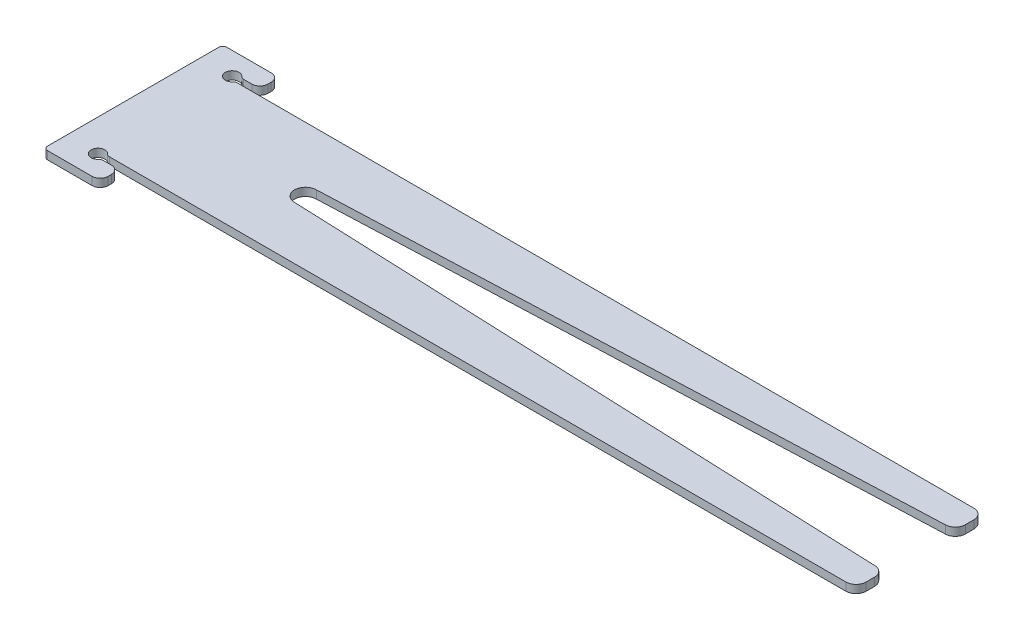
ISO-10303-21;
HEADER;
FILE_DESCRIPTION(('STEP AP214'),'2;1');
FILE_NAME('part.step','',(''),(''),'','','');
FILE_SCHEMA(('AUTOMOTIVE_DESIGN { 1 0 10303 214 1 1 1 1 }'));
ENDSEC;
DATA;
#1=APPLICATION_CONTEXT('core data for automotive mechanical design processes');
#2=APPLICATION_PROTOCOL_DEFINITION('international standard','automotive_design',2000,#1);
#3=PRODUCT_CONTEXT('',#1,'mechanical');
#4=PRODUCT('Part','Part','',(#3));
#5=PRODUCT_RELATED_PRODUCT_CATEGORY('part','',(#4));
#6=PRODUCT_DEFINITION_FORMATION('','',#4);
#7=PRODUCT_DEFINITION_CONTEXT('part definition',#1,'design');
#8=PRODUCT_DEFINITION('design','',#6,#7);
#9=PRODUCT_DEFINITION_SHAPE('','',#8);
#10=(LENGTH_UNIT() NAMED_UNIT(*) SI_UNIT(.MILLI.,.METRE.));
#11=(NAMED_UNIT(*) PLANE_ANGLE_UNIT() SI_UNIT($,.RADIAN.));
#12=(NAMED_UNIT(*) SI_UNIT($,.STERADIAN.) SOLID_ANGLE_UNIT());
#13=UNCERTAINTY_MEASURE_WITH_UNIT(LENGTH_MEASURE(1.E-05),#10,'distance_accuracy_value','');
#14=(GEOMETRIC_REPRESENTATION_CONTEXT(3) GLOBAL_UNCERTAINTY_ASSIGNED_CONTEXT((#13)) GLOBAL_UNIT_ASSIGNED_CONTEXT((#10,
#11,#12)) REPRESENTATION_CONTEXT('',''));
#15=CARTESIAN_POINT('',(0.,0.,0.));
#16=DIRECTION('',(0.,0.,1.));
#17=DIRECTION('',(1.,0.,0.));
#18=AXIS2_PLACEMENT_3D('',#15,#16,#17);
#19=CARTESIAN_POINT('',(-40.8449149219397,2.,7.08866538839723));
#20=DIRECTION('',(0.,-1.,0.));
#21=DIRECTION('',(0.,0.,-1.));
#22=AXIS2_PLACEMENT_3D('',#19,#20,#21);
#23=CYLINDRICAL_SURFACE('',#22,2.7);
#24=CARTESIAN_POINT('',(-40.8449149219397,0.,7.08866538839723));
#25=DIRECTION('',(0.,1.,0.));
#26=DIRECTION('',(0.,0.,1.));
#27=AXIS2_PLACEMENT_3D('',#24,#25,#26);
#28=CIRCLE('',#27,2.7);
#29=CARTESIAN_POINT('',(-40.8449149219397,0.,4.38866538839723));
#30=VERTEX_POINT('',#29);
#31=CARTESIAN_POINT('',(-40.8449149219397,0.,9.78866538839722));
#32=VERTEX_POINT('',#31);
#33=EDGE_CURVE('E237',#30,#32,#28,.T.);
#34=ORIENTED_EDGE('',*,*,#33,.F.);
#35=DIRECTION('',(0.,-1.,0.));
#36=VECTOR('',#35,1.);
#37=CARTESIAN_POINT('',(-40.8449149219397,2.,4.38866538839723));
#38=LINE('',#37,#36);
#39=CARTESIAN_POINT('',(-40.8449149219397,2.,4.38866538839723));
#40=VERTEX_POINT('',#39);
#41=EDGE_CURVE('E231',#40,#30,#38,.T.);
#42=ORIENTED_EDGE('',*,*,#41,.F.);
#43=CARTESIAN_POINT('',(-40.8449149219397,2.,7.08866538839723));
#44=DIRECTION('',(0.,1.,0.));
#45=DIRECTION('',(0.,0.,1.));
#46=AXIS2_PLACEMENT_3D('',#43,#44,#45);
#47=CIRCLE('',#46,2.7);
#48=CARTESIAN_POINT('',(-40.8449149219397,2.,9.78866538839722));
#49=VERTEX_POINT('',#48);
#50=EDGE_CURVE('E234',#40,#49,#47,.T.);
#51=ORIENTED_EDGE('',*,*,#50,.T.);
#52=DIRECTION('',(0.,-1.,0.));
#53=VECTOR('',#52,1.);
#54=CARTESIAN_POINT('',(-40.8449149219397,2.,9.78866538839722));
#55=LINE('',#54,#53);
#56=EDGE_CURVE('E242',#49,#32,#55,.T.);
#57=ORIENTED_EDGE('',*,*,#56,.T.);
#58=EDGE_LOOP('',(#34,#42,#51,#57));
#59=FACE_BOUND('',#58,.T.);
#60=ADVANCED_FACE('F33',(#59),#23,.F.);
#61=CARTESIAN_POINT('',(0.110435685191997,2.,2.73485444792539));
#62=DIRECTION('',(-0.0403479448080517,0.,-0.999185690124597));
#63=DIRECTION('',(-0.999185690124597,0.,0.0403479448080517));
#64=AXIS2_PLACEMENT_3D('',#61,#62,#63);
#65=PLANE('',#64);
#66=DIRECTION('',(0.999185690124597,0.,-0.0403479448080517));
#67=VECTOR('',#66,1.);
#68=CARTESIAN_POINT('',(0.110435685191997,0.,2.73485444792539));
#69=LINE('',#68,#67);
#70=CARTESIAN_POINT('',(109.05595494008,0.,-1.66445575179597));
#71=VERTEX_POINT('',#70);
#72=EDGE_CURVE('E294',#30,#71,#69,.T.);
#73=ORIENTED_EDGE('',*,*,#72,.T.);
#74=DIRECTION('',(0.,-1.,0.));
#75=VECTOR('',#74,1.);
#76=CARTESIAN_POINT('',(109.05595494008,2.,-1.66445575179597));
#77=LINE('',#76,#75);
#78=CARTESIAN_POINT('',(109.05595494008,2.,-1.66445575179597));
#79=VERTEX_POINT('',#78);
#80=EDGE_CURVE('E11',#71,#79,#77,.F.);
#81=ORIENTED_EDGE('',*,*,#80,.T.);
#82=DIRECTION('',(0.999185690124597,0.,-0.0403479448080517));
#83=VECTOR('',#82,1.);
#84=CARTESIAN_POINT('',(0.110435685191997,2.,2.73485444792539));
#85=LINE('',#84,#83);
#86=EDGE_CURVE('E244',#40,#79,#85,.T.);
#87=ORIENTED_EDGE('',*,*,#86,.F.);
#88=ORIENTED_EDGE('',*,*,#41,.T.);
#89=EDGE_LOOP('',(#73,#81,#87,#88));
#90=FACE_BOUND('',#89,.T.);
#91=ADVANCED_FACE('F245',(#90),#65,.F.);
#92=CARTESIAN_POINT('',(111.45508507806,2.,0.));
#93=DIRECTION('',(1.,0.,0.));
#94=DIRECTION('',(0.,0.,-1.));
#95=AXIS2_PLACEMENT_3D('',#92,#93,#94);
#96=PLANE('',#95);
#97=DIRECTION('',(0.,0.,1.));
#98=VECTOR('',#97,1.);
#99=CARTESIAN_POINT('',(111.45508507806,0.,0.));
#100=LINE('',#99,#98);
#101=CARTESIAN_POINT('',(111.45508507806,0.,-6.26133461160277));
#102=VERTEX_POINT('',#101);
#103=CARTESIAN_POINT('',(111.45508507806,0.,-4.16241997710746));
#104=VERTEX_POINT('',#103);
#105=EDGE_CURVE('E296',#102,#104,#100,.T.);
#106=ORIENTED_EDGE('',*,*,#105,.F.);
#107=DIRECTION('',(0.,-1.,0.));
#108=VECTOR('',#107,1.);
#109=CARTESIAN_POINT('',(111.45508507806,2.,-6.26133461160277));
#110=LINE('',#109,#108);
#111=CARTESIAN_POINT('',(111.45508507806,2.,-6.26133461160277));
#112=VERTEX_POINT('',#111);
#113=EDGE_CURVE('E41',#102,#112,#110,.F.);
#114=ORIENTED_EDGE('',*,*,#113,.T.);
#115=DIRECTION('',(0.,0.,1.));
#116=VECTOR('',#115,1.);
#117=CARTESIAN_POINT('',(111.45508507806,2.,0.));
#118=LINE('',#117,#116);
#119=CARTESIAN_POINT('',(111.45508507806,2.,-4.16241997710746));
#120=VERTEX_POINT('',#119);
#121=EDGE_CURVE('E247',#112,#120,#118,.T.);
#122=ORIENTED_EDGE('',*,*,#121,.T.);
#123=DIRECTION('',(0.,-1.,0.));
#124=VECTOR('',#123,1.);
#125=CARTESIAN_POINT('',(111.45508507806,0.,-4.16241997710746));
#126=LINE('',#125,#124);
#127=EDGE_CURVE('E452',#120,#104,#126,.T.);
#128=ORIENTED_EDGE('',*,*,#127,.T.);
#129=EDGE_LOOP('',(#106,#114,#122,#128));
#130=FACE_BOUND('',#129,.T.);
#131=ADVANCED_FACE('F457',(#130),#96,.T.);
#132=CARTESIAN_POINT('',(0.,2.,-8.76133461160278));
#133=DIRECTION('',(0.,0.,-1.));
#134=DIRECTION('',(-1.,0.,0.));
#135=AXIS2_PLACEMENT_3D('',#132,#133,#134);
#136=PLANE('',#135);
#137=DIRECTION('',(1.,0.,0.));
#138=VECTOR('',#137,1.);
#139=CARTESIAN_POINT('',(0.,2.,-8.76133461160278));
#140=LINE('',#139,#138);
#141=CARTESIAN_POINT('',(-73.6103695181701,2.,-8.76133461160278));
#142=VERTEX_POINT('',#141);
#143=CARTESIAN_POINT('',(108.95508507806,2.,-8.76133461160278));
#144=VERTEX_POINT('',#143);
#145=EDGE_CURVE('E260',#142,#144,#140,.T.);
#146=ORIENTED_EDGE('',*,*,#145,.T.);
#147=DIRECTION('',(0.,-1.,0.));
#148=VECTOR('',#147,1.);
#149=CARTESIAN_POINT('',(108.95508507806,2.,-8.76133461160278));
#150=LINE('',#149,#148);
#151=CARTESIAN_POINT('',(108.95508507806,0.,-8.76133461160278));
#152=VERTEX_POINT('',#151);
#153=EDGE_CURVE('E449',#144,#152,#150,.T.);
#154=ORIENTED_EDGE('',*,*,#153,.T.);
#155=DIRECTION('',(1.,0.,0.));
#156=VECTOR('',#155,1.);
#157=CARTESIAN_POINT('',(0.,0.,-8.76133461160278));
#158=LINE('',#157,#156);
#159=CARTESIAN_POINT('',(-73.6103695181701,0.,-8.76133461160278));
#160=VERTEX_POINT('',#159);
#161=EDGE_CURVE('E299',#160,#152,#158,.T.);
#162=ORIENTED_EDGE('',*,*,#161,.F.);
#163=DIRECTION('',(0.,-1.,0.));
#164=VECTOR('',#163,1.);
#165=CARTESIAN_POINT('',(-73.6103695181701,2.,-8.76133461160278));
#166=LINE('',#165,#164);
#167=EDGE_CURVE('E374',#160,#142,#166,.F.);
#168=ORIENTED_EDGE('',*,*,#167,.T.);
#169=EDGE_LOOP('',(#146,#154,#162,#168));
#170=FACE_BOUND('',#169,.T.);
#171=ADVANCED_FACE('F464',(#170),#136,.T.);
#172=CARTESIAN_POINT('',(-75.6449149219397,2.,-9.53633461160278));
#173=DIRECTION('',(0.,-1.,0.));
#174=DIRECTION('',(0.,0.,-1.));
#175=AXIS2_PLACEMENT_3D('',#172,#173,#174);
#176=CYLINDRICAL_SURFACE('',#175,1.7);
#177=CARTESIAN_POINT('',(-75.6449149219397,2.,-9.53633461160278));
#178=DIRECTION('',(0.,1.,0.));
#179=DIRECTION('',(0.,0.,1.));
#180=AXIS2_PLACEMENT_3D('',#177,#178,#179);
#181=CIRCLE('',#180,1.7);
#182=CARTESIAN_POINT('',(-74.3639048528996,2.,-10.6539272041954));
#183=VERTEX_POINT('',#182);
#184=CARTESIAN_POINT('',(-74.3639048528996,2.,-8.41874201901018));
#185=VERTEX_POINT('',#184);
#186=EDGE_CURVE('E262',#183,#185,#181,.T.);
#187=ORIENTED_EDGE('',*,*,#186,.T.);
#188=DIRECTION('',(0.,-1.,0.));
#189=VECTOR('',#188,1.);
#190=CARTESIAN_POINT('',(-74.3639048528996,2.,-8.41874201901019));
#191=LINE('',#190,#189);
#192=CARTESIAN_POINT('',(-74.3639048528996,0.,-8.41874201901018));
#193=VERTEX_POINT('',#192);
#194=EDGE_CURVE('E371',#185,#193,#191,.T.);
#195=ORIENTED_EDGE('',*,*,#194,.T.);
#196=CARTESIAN_POINT('',(-75.6449149219397,0.,-9.53633461160278));
#197=DIRECTION('',(0.,1.,0.));
#198=DIRECTION('',(0.,0.,1.));
#199=AXIS2_PLACEMENT_3D('',#196,#197,#198);
#200=CIRCLE('',#199,1.7);
#201=CARTESIAN_POINT('',(-74.3639048528996,0.,-10.6539272041954));
#202=VERTEX_POINT('',#201);
#203=EDGE_CURVE('E302',#202,#193,#200,.T.);
#204=ORIENTED_EDGE('',*,*,#203,.F.);
#205=DIRECTION('',(0.,-1.,0.));
#206=VECTOR('',#205,1.);
#207=CARTESIAN_POINT('',(-74.3639048528996,2.,-10.6539272041954));
#208=LINE('',#207,#206);
#209=EDGE_CURVE('E369',#202,#183,#208,.F.);
#210=ORIENTED_EDGE('',*,*,#209,.T.);
#211=EDGE_LOOP('',(#187,#195,#204,#210));
#212=FACE_BOUND('',#211,.T.);
#213=ADVANCED_FACE('F474',(#212),#176,.F.);
#214=CARTESIAN_POINT('',(0.,2.,-10.3113346116028));
#215=DIRECTION('',(0.,0.,1.));
#216=DIRECTION('',(1.,0.,0.));
#217=AXIS2_PLACEMENT_3D('',#214,#215,#216);
#218=PLANE('',#217);
#219=DIRECTION('',(-1.,0.,0.));
#220=VECTOR('',#219,1.);
#221=CARTESIAN_POINT('',(0.,0.,-10.3113346116028));
#222=LINE('',#221,#220);
#223=CARTESIAN_POINT('',(-71.5449149219397,0.,-10.3113346116028));
#224=VERTEX_POINT('',#223);
#225=CARTESIAN_POINT('',(-73.6103695181701,0.,-10.3113346116028));
#226=VERTEX_POINT('',#225);
#227=EDGE_CURVE('E305',#224,#226,#222,.T.);
#228=ORIENTED_EDGE('',*,*,#227,.F.);
#229=DIRECTION('',(0.,-1.,0.));
#230=VECTOR('',#229,1.);
#231=CARTESIAN_POINT('',(-71.5449149219397,2.,-10.3113346116028));
#232=LINE('',#231,#230);
#233=CARTESIAN_POINT('',(-71.5449149219397,2.,-10.3113346116028));
#234=VERTEX_POINT('',#233);
#235=EDGE_CURVE('E420',#224,#234,#232,.F.);
#236=ORIENTED_EDGE('',*,*,#235,.T.);
#237=DIRECTION('',(-1.,0.,0.));
#238=VECTOR('',#237,1.);
#239=CARTESIAN_POINT('',(0.,2.,-10.3113346116028));
#240=LINE('',#239,#238);
#241=CARTESIAN_POINT('',(-73.6103695181701,2.,-10.3113346116028));
#242=VERTEX_POINT('',#241);
#243=EDGE_CURVE('E265',#234,#242,#240,.T.);
#244=ORIENTED_EDGE('',*,*,#243,.T.);
#245=DIRECTION('',(0.,-1.,0.));
#246=VECTOR('',#245,1.);
#247=CARTESIAN_POINT('',(-73.6103695181701,2.,-10.3113346116028));
#248=LINE('',#247,#246);
#249=EDGE_CURVE('E376',#242,#226,#248,.T.);
#250=ORIENTED_EDGE('',*,*,#249,.T.);
#251=EDGE_LOOP('',(#228,#236,#244,#250));
#252=FACE_BOUND('',#251,.T.);
#253=ADVANCED_FACE('F485',(#252),#218,.T.);
#254=CARTESIAN_POINT('',(-69.5449149219397,2.,0.));
#255=DIRECTION('',(1.,0.,0.));
#256=DIRECTION('',(0.,0.,-1.));
#257=AXIS2_PLACEMENT_3D('',#254,#255,#256);
#258=PLANE('',#257);
#259=DIRECTION('',(0.,0.,1.));
#260=VECTOR('',#259,1.);
#261=CARTESIAN_POINT('',(-69.5449149219397,0.,0.));
#262=LINE('',#261,#260);
#263=CARTESIAN_POINT('',(-69.5449149219397,0.,-13.1113346116028));
#264=VERTEX_POINT('',#263);
#265=CARTESIAN_POINT('',(-69.5449149219397,0.,-12.3113346116028));
#266=VERTEX_POINT('',#265);
#267=EDGE_CURVE('E307',#264,#266,#262,.T.);
#268=ORIENTED_EDGE('',*,*,#267,.F.);
#269=DIRECTION('',(0.,-1.,0.));
#270=VECTOR('',#269,1.);
#271=CARTESIAN_POINT('',(-69.5449149219397,2.,-13.1113346116028));
#272=LINE('',#271,#270);
#273=CARTESIAN_POINT('',(-69.5449149219397,2.,-13.1113346116028));
#274=VERTEX_POINT('',#273);
#275=EDGE_CURVE('E403',#264,#274,#272,.F.);
#276=ORIENTED_EDGE('',*,*,#275,.T.);
#277=DIRECTION('',(0.,0.,1.));
#278=VECTOR('',#277,1.);
#279=CARTESIAN_POINT('',(-69.5449149219397,2.,0.));
#280=LINE('',#279,#278);
#281=CARTESIAN_POINT('',(-69.5449149219397,2.,-12.3113346116028));
#282=VERTEX_POINT('',#281);
#283=EDGE_CURVE('E267',#274,#282,#280,.T.);
#284=ORIENTED_EDGE('',*,*,#283,.T.);
#285=DIRECTION('',(0.,-1.,0.));
#286=VECTOR('',#285,1.);
#287=CARTESIAN_POINT('',(-69.5449149219397,2.,-12.3113346116028));
#288=LINE('',#287,#286);
#289=EDGE_CURVE('E400',#282,#266,#288,.T.);
#290=ORIENTED_EDGE('',*,*,#289,.T.);
#291=EDGE_LOOP('',(#268,#276,#284,#290));
#292=FACE_BOUND('',#291,.T.);
#293=ADVANCED_FACE('F494',(#292),#258,.T.);
#294=CARTESIAN_POINT('',(0.,2.,-15.1113346116028));
#295=DIRECTION('',(0.,0.,-1.));
#296=DIRECTION('',(-1.,0.,0.));
#297=AXIS2_PLACEMENT_3D('',#294,#295,#296);
#298=PLANE('',#297);
#299=DIRECTION('',(1.,0.,0.));
#300=VECTOR('',#299,1.);
#301=CARTESIAN_POINT('',(0.,2.,-15.1113346116028));
#302=LINE('',#301,#300);
#303=CARTESIAN_POINT('',(-82.5449149219397,2.,-15.1113346116028));
#304=VERTEX_POINT('',#303);
#305=CARTESIAN_POINT('',(-71.5449149219397,2.,-15.1113346116028));
#306=VERTEX_POINT('',#305);
#307=EDGE_CURVE('E270',#304,#306,#302,.T.);
#308=ORIENTED_EDGE('',*,*,#307,.T.);
#309=DIRECTION('',(0.,-1.,0.));
#310=VECTOR('',#309,1.);
#311=CARTESIAN_POINT('',(-71.5449149219397,2.,-15.1113346116028));
#312=LINE('',#311,#310);
#313=CARTESIAN_POINT('',(-71.5449149219397,0.,-15.1113346116028));
#314=VERTEX_POINT('',#313);
#315=EDGE_CURVE('E389',#306,#314,#312,.T.);
#316=ORIENTED_EDGE('',*,*,#315,.T.);
#317=DIRECTION('',(1.,0.,0.));
#318=VECTOR('',#317,1.);
#319=CARTESIAN_POINT('',(0.,0.,-15.1113346116028));
#320=LINE('',#319,#318);
#321=CARTESIAN_POINT('',(-82.5449149219397,0.,-15.1113346116028));
#322=VERTEX_POINT('',#321);
#323=EDGE_CURVE('E310',#322,#314,#320,.T.);
#324=ORIENTED_EDGE('',*,*,#323,.F.);
#325=DIRECTION('',(0.,-1.,0.));
#326=VECTOR('',#325,1.);
#327=CARTESIAN_POINT('',(-82.5449149219397,2.,-15.1113346116028));
#328=LINE('',#327,#326);
#329=EDGE_CURVE('E384',#322,#304,#328,.F.);
#330=ORIENTED_EDGE('',*,*,#329,.T.);
#331=EDGE_LOOP('',(#308,#316,#324,#330));
#332=FACE_BOUND('',#331,.T.);
#333=ADVANCED_FACE('F502',(#332),#298,.T.);
#334=CARTESIAN_POINT('',(-83.5449149219397,2.,0.));
#335=DIRECTION('',(1.,0.,0.));
#336=DIRECTION('',(0.,0.,-1.));
#337=AXIS2_PLACEMENT_3D('',#334,#335,#336);
#338=PLANE('',#337);
#339=DIRECTION('',(0.,0.,1.));
#340=VECTOR('',#339,1.);
#341=CARTESIAN_POINT('',(-83.5449149219397,2.,0.));
#342=LINE('',#341,#340);
#343=CARTESIAN_POINT('',(-83.5449149219397,2.,-14.1113346116028));
#344=VERTEX_POINT('',#343);
#345=CARTESIAN_POINT('',(-83.5449149219397,2.,28.2886653883972));
#346=VERTEX_POINT('',#345);
#347=EDGE_CURVE('E273',#344,#346,#342,.T.);
#348=ORIENTED_EDGE('',*,*,#347,.F.);
#349=DIRECTION('',(0.,-1.,0.));
#350=VECTOR('',#349,1.);
#351=CARTESIAN_POINT('',(-83.5449149219397,0.,-14.1113346116028));
#352=LINE('',#351,#350);
#353=CARTESIAN_POINT('',(-83.5449149219397,0.,-14.1113346116028));
#354=VERTEX_POINT('',#353);
#355=EDGE_CURVE('E381',#344,#354,#352,.T.);
#356=ORIENTED_EDGE('',*,*,#355,.T.);
#357=DIRECTION('',(0.,0.,1.));
#358=VECTOR('',#357,1.);
#359=CARTESIAN_POINT('',(-83.5449149219397,0.,0.));
#360=LINE('',#359,#358);
#361=CARTESIAN_POINT('',(-83.5449149219397,0.,28.2886653883972));
#362=VERTEX_POINT('',#361);
#363=EDGE_CURVE('E313',#354,#362,#360,.T.);
#364=ORIENTED_EDGE('',*,*,#363,.T.);
#365=DIRECTION('',(0.,-1.,0.));
#366=VECTOR('',#365,1.);
#367=CARTESIAN_POINT('',(-83.5449149219397,2.,28.2886653883972));
#368=LINE('',#367,#366);
#369=EDGE_CURVE('E379',#362,#346,#368,.F.);
#370=ORIENTED_EDGE('',*,*,#369,.T.);
#371=EDGE_LOOP('',(#348,#356,#364,#370));
#372=FACE_BOUND('',#371,.T.);
#373=ADVANCED_FACE('F512',(#372),#338,.F.);
#374=CARTESIAN_POINT('',(0.,2.,29.2886653883972));
#375=DIRECTION('',(0.,0.,-1.));
#376=DIRECTION('',(-1.,0.,0.));
#377=AXIS2_PLACEMENT_3D('',#374,#375,#376);
#378=PLANE('',#377);
#379=DIRECTION('',(1.,0.,0.));
#380=VECTOR('',#379,1.);
#381=CARTESIAN_POINT('',(0.,0.,29.2886653883972));
#382=LINE('',#381,#380);
#383=CARTESIAN_POINT('',(-82.5449149219397,0.,29.2886653883972));
#384=VERTEX_POINT('',#383);
#385=CARTESIAN_POINT('',(-71.5449149219397,0.,29.2886653883972));
#386=VERTEX_POINT('',#385);
#387=EDGE_CURVE('E316',#384,#386,#382,.T.);
#388=ORIENTED_EDGE('',*,*,#387,.T.);
#389=DIRECTION('',(0.,-1.,0.));
#390=VECTOR('',#389,1.);
#391=CARTESIAN_POINT('',(-71.5449149219397,2.,29.2886653883972));
#392=LINE('',#391,#390);
#393=CARTESIAN_POINT('',(-71.5449149219397,2.,29.2886653883972));
#394=VERTEX_POINT('',#393);
#395=EDGE_CURVE('E418',#386,#394,#392,.F.);
#396=ORIENTED_EDGE('',*,*,#395,.T.);
#397=DIRECTION('',(1.,0.,0.));
#398=VECTOR('',#397,1.);
#399=CARTESIAN_POINT('',(0.,2.,29.2886653883972));
#400=LINE('',#399,#398);
#401=CARTESIAN_POINT('',(-82.5449149219397,2.,29.2886653883972));
#402=VERTEX_POINT('',#401);
#403=EDGE_CURVE('E276',#402,#394,#400,.T.);
#404=ORIENTED_EDGE('',*,*,#403,.F.);
#405=DIRECTION('',(0.,-1.,0.));
#406=VECTOR('',#405,1.);
#407=CARTESIAN_POINT('',(-82.5449149219397,2.,29.2886653883972));
#408=LINE('',#407,#406);
#409=EDGE_CURVE('E386',#402,#384,#408,.T.);
#410=ORIENTED_EDGE('',*,*,#409,.T.);
#411=EDGE_LOOP('',(#388,#396,#404,#410));
#412=FACE_BOUND('',#411,.T.);
#413=ADVANCED_FACE('F521',(#412),#378,.F.);
#414=CARTESIAN_POINT('',(-69.5449149219397,2.,0.));
#415=DIRECTION('',(1.,0.,0.));
#416=DIRECTION('',(0.,0.,-1.));
#417=AXIS2_PLACEMENT_3D('',#414,#415,#416);
#418=PLANE('',#417);
#419=DIRECTION('',(0.,0.,1.));
#420=VECTOR('',#419,1.);
#421=CARTESIAN_POINT('',(-69.5449149219397,2.,0.));
#422=LINE('',#421,#420);
#423=CARTESIAN_POINT('',(-69.5449149219397,2.,26.4886653883972));
#424=VERTEX_POINT('',#423);
#425=CARTESIAN_POINT('',(-69.5449149219397,2.,27.2886653883972));
#426=VERTEX_POINT('',#425);
#427=EDGE_CURVE('E279',#424,#426,#422,.T.);
#428=ORIENTED_EDGE('',*,*,#427,.T.);
#429=DIRECTION('',(0.,-1.,0.));
#430=VECTOR('',#429,1.);
#431=CARTESIAN_POINT('',(-69.5449149219397,0.,27.2886653883972));
#432=LINE('',#431,#430);
#433=CARTESIAN_POINT('',(-69.5449149219397,0.,27.2886653883972));
#434=VERTEX_POINT('',#433);
#435=EDGE_CURVE('E415',#426,#434,#432,.T.);
#436=ORIENTED_EDGE('',*,*,#435,.T.);
#437=DIRECTION('',(0.,0.,1.));
#438=VECTOR('',#437,1.);
#439=CARTESIAN_POINT('',(-69.5449149219397,0.,0.));
#440=LINE('',#439,#438);
#441=CARTESIAN_POINT('',(-69.5449149219397,0.,26.4886653883972));
#442=VERTEX_POINT('',#441);
#443=EDGE_CURVE('E319',#442,#434,#440,.T.);
#444=ORIENTED_EDGE('',*,*,#443,.F.);
#445=DIRECTION('',(0.,-1.,0.));
#446=VECTOR('',#445,1.);
#447=CARTESIAN_POINT('',(-69.5449149219397,2.,26.4886653883972));
#448=LINE('',#447,#446);
#449=EDGE_CURVE('E413',#442,#424,#448,.F.);
#450=ORIENTED_EDGE('',*,*,#449,.T.);
#451=EDGE_LOOP('',(#428,#436,#444,#450));
#452=FACE_BOUND('',#451,.T.);
#453=ADVANCED_FACE('F530',(#452),#418,.T.);
#454=CARTESIAN_POINT('',(0.,2.,24.4886653883972));
#455=DIRECTION('',(0.,0.,1.));
#456=DIRECTION('',(1.,0.,0.));
#457=AXIS2_PLACEMENT_3D('',#454,#455,#456);
#458=PLANE('',#457);
#459=DIRECTION('',(-1.,0.,0.));
#460=VECTOR('',#459,1.);
#461=CARTESIAN_POINT('',(0.,2.,24.4886653883972));
#462=LINE('',#461,#460);
#463=CARTESIAN_POINT('',(-71.5449149219397,2.,24.4886653883972));
#464=VERTEX_POINT('',#463);
#465=CARTESIAN_POINT('',(-73.6103695181701,2.,24.4886653883972));
#466=VERTEX_POINT('',#465);
#467=EDGE_CURVE('E282',#464,#466,#462,.T.);
#468=ORIENTED_EDGE('',*,*,#467,.F.);
#469=DIRECTION('',(0.,-1.,0.));
#470=VECTOR('',#469,1.);
#471=CARTESIAN_POINT('',(-71.5449149219397,0.,24.4886653883972));
#472=LINE('',#471,#470);
#473=CARTESIAN_POINT('',(-71.5449149219397,0.,24.4886653883972));
#474=VERTEX_POINT('',#473);
#475=EDGE_CURVE('E422',#464,#474,#472,.T.);
#476=ORIENTED_EDGE('',*,*,#475,.T.);
#477=DIRECTION('',(-1.,0.,0.));
#478=VECTOR('',#477,1.);
#479=CARTESIAN_POINT('',(0.,0.,24.4886653883972));
#480=LINE('',#479,#478);
#481=CARTESIAN_POINT('',(-73.6103695181701,0.,24.4886653883972));
#482=VERTEX_POINT('',#481);
#483=EDGE_CURVE('E322',#474,#482,#480,.T.);
#484=ORIENTED_EDGE('',*,*,#483,.T.);
#485=DIRECTION('',(0.,-1.,0.));
#486=VECTOR('',#485,1.);
#487=CARTESIAN_POINT('',(-73.6103695181701,2.,24.4886653883972));
#488=LINE('',#487,#486);
#489=EDGE_CURVE('E349',#482,#466,#488,.F.);
#490=ORIENTED_EDGE('',*,*,#489,.T.);
#491=EDGE_LOOP('',(#468,#476,#484,#490));
#492=FACE_BOUND('',#491,.T.);
#493=ADVANCED_FACE('F539',(#492),#458,.F.);
#494=CARTESIAN_POINT('',(-75.6449149219397,2.,23.7136653883972));
#495=DIRECTION('',(0.,-1.,0.));
#496=DIRECTION('',(0.,0.,-1.));
#497=AXIS2_PLACEMENT_3D('',#494,#495,#496);
#498=CYLINDRICAL_SURFACE('',#497,1.7);
#499=CARTESIAN_POINT('',(-75.6449149219397,2.,23.7136653883972));
#500=DIRECTION('',(0.,1.,0.));
#501=DIRECTION('',(0.,0.,1.));
#502=AXIS2_PLACEMENT_3D('',#499,#500,#501);
#503=CIRCLE('',#502,1.7);
#504=CARTESIAN_POINT('',(-74.3639048528996,2.,24.8312579809898));
#505=VERTEX_POINT('',#504);
#506=CARTESIAN_POINT('',(-74.3639048528996,2.,22.5960727958046));
#507=VERTEX_POINT('',#506);
#508=EDGE_CURVE('E284',#505,#507,#503,.F.);
#509=ORIENTED_EDGE('',*,*,#508,.F.);
#510=DIRECTION('',(0.,-1.,0.));
#511=VECTOR('',#510,1.);
#512=CARTESIAN_POINT('',(-74.3639048528996,2.,24.8312579809898));
#513=LINE('',#512,#511);
#514=CARTESIAN_POINT('',(-74.3639048528996,0.,24.8312579809898));
#515=VERTEX_POINT('',#514);
#516=EDGE_CURVE('E333',#505,#515,#513,.T.);
#517=ORIENTED_EDGE('',*,*,#516,.T.);
#518=CARTESIAN_POINT('',(-75.6449149219397,0.,23.7136653883972));
#519=DIRECTION('',(0.,1.,0.));
#520=DIRECTION('',(0.,0.,1.));
#521=AXIS2_PLACEMENT_3D('',#518,#519,#520);
#522=CIRCLE('',#521,1.7);
#523=CARTESIAN_POINT('',(-74.3639048528996,0.,22.5960727958046));
#524=VERTEX_POINT('',#523);
#525=EDGE_CURVE('E324',#515,#524,#522,.F.);
#526=ORIENTED_EDGE('',*,*,#525,.T.);
#527=DIRECTION('',(0.,-1.,0.));
#528=VECTOR('',#527,1.);
#529=CARTESIAN_POINT('',(-74.3639048528996,2.,22.5960727958046));
#530=LINE('',#529,#528);
#531=EDGE_CURVE('E241',#524,#507,#530,.F.);
#532=ORIENTED_EDGE('',*,*,#531,.T.);
#533=EDGE_LOOP('',(#509,#517,#526,#532));
#534=FACE_BOUND('',#533,.T.);
#535=ADVANCED_FACE('F547',(#534),#498,.F.);
#536=CARTESIAN_POINT('',(0.,2.,22.9386653883972));
#537=DIRECTION('',(0.,0.,1.));
#538=DIRECTION('',(1.,0.,0.));
#539=AXIS2_PLACEMENT_3D('',#536,#537,#538);
#540=PLANE('',#539);
#541=DIRECTION('',(-1.,0.,0.));
#542=VECTOR('',#541,1.);
#543=CARTESIAN_POINT('',(0.,0.,22.9386653883972));
#544=LINE('',#543,#542);
#545=CARTESIAN_POINT('',(108.95508507806,0.,22.9386653883971));
#546=VERTEX_POINT('',#545);
#547=CARTESIAN_POINT('',(-73.6103695181701,0.,22.9386653883972));
#548=VERTEX_POINT('',#547);
#549=EDGE_CURVE('E327',#546,#548,#544,.T.);
#550=ORIENTED_EDGE('',*,*,#549,.F.);
#551=DIRECTION('',(0.,-1.,0.));
#552=VECTOR('',#551,1.);
#553=CARTESIAN_POINT('',(108.95508507806,2.,22.9386653883971));
#554=LINE('',#553,#552);
#555=CARTESIAN_POINT('',(108.95508507806,2.,22.9386653883971));
#556=VERTEX_POINT('',#555);
#557=EDGE_CURVE('E438',#546,#556,#554,.F.);
#558=ORIENTED_EDGE('',*,*,#557,.T.);
#559=DIRECTION('',(-1.,0.,0.));
#560=VECTOR('',#559,1.);
#561=CARTESIAN_POINT('',(0.,2.,22.9386653883972));
#562=LINE('',#561,#560);
#563=CARTESIAN_POINT('',(-73.6103695181701,2.,22.9386653883972));
#564=VERTEX_POINT('',#563);
#565=EDGE_CURVE('E287',#556,#564,#562,.T.);
#566=ORIENTED_EDGE('',*,*,#565,.T.);
#567=DIRECTION('',(0.,1.,0.));
#568=VECTOR('',#567,1.);
#569=CARTESIAN_POINT('',(-73.6103695181701,0.,22.9386653883972));
#570=LINE('',#569,#568);
#571=EDGE_CURVE('E366',#564,#548,#570,.F.);
#572=ORIENTED_EDGE('',*,*,#571,.T.);
#573=EDGE_LOOP('',(#550,#558,#566,#572));
#574=FACE_BOUND('',#573,.T.);
#575=ADVANCED_FACE('F713',(#574),#540,.T.);
#576=CARTESIAN_POINT('',(111.45508507806,2.,0.));
#577=DIRECTION('',(1.,0.,0.));
#578=DIRECTION('',(0.,0.,-1.));
#579=AXIS2_PLACEMENT_3D('',#576,#577,#578);
#580=PLANE('',#579);
#581=DIRECTION('',(0.,0.,1.));
#582=VECTOR('',#581,1.);
#583=CARTESIAN_POINT('',(111.45508507806,2.,0.));
#584=LINE('',#583,#582);
#585=CARTESIAN_POINT('',(111.45508507806,2.,18.3397507539019));
#586=VERTEX_POINT('',#585);
#587=CARTESIAN_POINT('',(111.45508507806,2.,20.4386653883971));
#588=VERTEX_POINT('',#587);
#589=EDGE_CURVE('E289',#586,#588,#584,.T.);
#590=ORIENTED_EDGE('',*,*,#589,.T.);
#591=DIRECTION('',(0.,-1.,0.));
#592=VECTOR('',#591,1.);
#593=CARTESIAN_POINT('',(111.45508507806,2.,20.4386653883971));
#594=LINE('',#593,#592);
#595=CARTESIAN_POINT('',(111.45508507806,0.,20.4386653883971));
#596=VERTEX_POINT('',#595);
#597=EDGE_CURVE('E427',#588,#596,#594,.T.);
#598=ORIENTED_EDGE('',*,*,#597,.T.);
#599=DIRECTION('',(0.,0.,1.));
#600=VECTOR('',#599,1.);
#601=CARTESIAN_POINT('',(111.45508507806,0.,0.));
#602=LINE('',#601,#600);
#603=CARTESIAN_POINT('',(111.45508507806,0.,18.3397507539019));
#604=VERTEX_POINT('',#603);
#605=EDGE_CURVE('E256',#604,#596,#602,.T.);
#606=ORIENTED_EDGE('',*,*,#605,.F.);
#607=DIRECTION('',(0.,-1.,0.));
#608=VECTOR('',#607,1.);
#609=CARTESIAN_POINT('',(111.45508507806,2.,18.3397507539019));
#610=LINE('',#609,#608);
#611=EDGE_CURVE('E425',#604,#586,#610,.F.);
#612=ORIENTED_EDGE('',*,*,#611,.T.);
#613=EDGE_LOOP('',(#590,#598,#606,#612));
#614=FACE_BOUND('',#613,.T.);
#615=ADVANCED_FACE('F564',(#614),#580,.T.);
#616=CARTESIAN_POINT('',(-0.461124667964759,2.,11.4193962489484));
#617=DIRECTION('',(0.0403479448080517,0.,-0.999185690124597));
#618=DIRECTION('',(-0.999185690124597,0.,-0.0403479448080517));
#619=AXIS2_PLACEMENT_3D('',#616,#617,#618);
#620=PLANE('',#619);
#621=DIRECTION('',(0.999185690124597,0.,0.0403479448080517));
#622=VECTOR('',#621,1.);
#623=CARTESIAN_POINT('',(-0.461124667964759,2.,11.4193962489484));
#624=LINE('',#623,#622);
#625=CARTESIAN_POINT('',(109.05595494008,2.,15.8417865285904));
#626=VERTEX_POINT('',#625);
#627=EDGE_CURVE('E252',#49,#626,#624,.T.);
#628=ORIENTED_EDGE('',*,*,#627,.T.);
#629=DIRECTION('',(0.,-1.,0.));
#630=VECTOR('',#629,1.);
#631=CARTESIAN_POINT('',(109.05595494008,2.,15.8417865285904));
#632=LINE('',#631,#630);
#633=CARTESIAN_POINT('',(109.05595494008,0.,15.8417865285904));
#634=VERTEX_POINT('',#633);
#635=EDGE_CURVE('E446',#626,#634,#632,.T.);
#636=ORIENTED_EDGE('',*,*,#635,.T.);
#637=DIRECTION('',(0.999185690124597,0.,0.0403479448080517));
#638=VECTOR('',#637,1.);
#639=CARTESIAN_POINT('',(-0.461124667964759,0.,11.4193962489484));
#640=LINE('',#639,#638);
#641=EDGE_CURVE('E253',#32,#634,#640,.T.);
#642=ORIENTED_EDGE('',*,*,#641,.F.);
#643=ORIENTED_EDGE('',*,*,#56,.F.);
#644=EDGE_LOOP('',(#628,#636,#642,#643));
#645=FACE_BOUND('',#644,.T.);
#646=ADVANCED_FACE('F573',(#645),#620,.T.);
#647=CARTESIAN_POINT('',(0.,2.,0.));
#648=DIRECTION('',(0.,1.,0.));
#649=DIRECTION('',(0.,0.,1.));
#650=AXIS2_PLACEMENT_3D('',#647,#648,#649);
#651=PLANE('',#650);
#652=ORIENTED_EDGE('',*,*,#565,.F.);
#653=CARTESIAN_POINT('',(108.95508507806,2.,20.4386653883971));
#654=DIRECTION('',(0.,1.,0.));
#655=DIRECTION('',(0.,0.,1.));
#656=AXIS2_PLACEMENT_3D('',#653,#654,#655);
#657=CIRCLE('',#656,2.5);
#658=EDGE_CURVE('E444',#556,#588,#657,.T.);
#659=ORIENTED_EDGE('',*,*,#658,.T.);
#660=ORIENTED_EDGE('',*,*,#589,.F.);
#661=CARTESIAN_POINT('',(108.95508507806,2.,18.3397507539019));
#662=DIRECTION('',(0.,1.,0.));
#663=DIRECTION('',(0.,0.,1.));
#664=AXIS2_PLACEMENT_3D('',#661,#662,#663);
#665=CIRCLE('',#664,2.5);
#666=EDGE_CURVE('E442',#586,#626,#665,.T.);
#667=ORIENTED_EDGE('',*,*,#666,.T.);
#668=ORIENTED_EDGE('',*,*,#627,.F.);
#669=ORIENTED_EDGE('',*,*,#50,.F.);
#670=ORIENTED_EDGE('',*,*,#86,.T.);
#671=CARTESIAN_POINT('',(108.95508507806,2.,-4.16241997710746));
#672=DIRECTION('',(0.,1.,0.));
#673=DIRECTION('',(0.,0.,1.));
#674=AXIS2_PLACEMENT_3D('',#671,#672,#673);
#675=CIRCLE('',#674,2.5);
#676=EDGE_CURVE('E54',#79,#120,#675,.T.);
#677=ORIENTED_EDGE('',*,*,#676,.T.);
#678=ORIENTED_EDGE('',*,*,#121,.F.);
#679=CARTESIAN_POINT('',(108.95508507806,2.,-6.26133461160277));
#680=DIRECTION('',(0.,1.,0.));
#681=DIRECTION('',(0.,0.,1.));
#682=AXIS2_PLACEMENT_3D('',#679,#680,#681);
#683=CIRCLE('',#682,2.5);
#684=EDGE_CURVE('E48',#112,#144,#683,.T.);
#685=ORIENTED_EDGE('',*,*,#684,.T.);
#686=ORIENTED_EDGE('',*,*,#145,.F.);
#687=CARTESIAN_POINT('',(-73.6103695181701,2.,-7.76133461160278));
#688=DIRECTION('',(0.,1.,0.));
#689=DIRECTION('',(0.,0.,1.));
#690=AXIS2_PLACEMENT_3D('',#687,#688,#689);
#691=CIRCLE('',#690,1.);
#692=EDGE_CURVE('E359',#142,#185,#691,.T.);
#693=ORIENTED_EDGE('',*,*,#692,.T.);
#694=ORIENTED_EDGE('',*,*,#186,.F.);
#695=CARTESIAN_POINT('',(-73.6103695181701,2.,-11.3113346116028));
#696=DIRECTION('',(0.,1.,0.));
#697=DIRECTION('',(0.,0.,1.));
#698=AXIS2_PLACEMENT_3D('',#695,#696,#697);
#699=CIRCLE('',#698,1.);
#700=EDGE_CURVE('E356',#183,#242,#699,.T.);
#701=ORIENTED_EDGE('',*,*,#700,.T.);
#702=ORIENTED_EDGE('',*,*,#243,.F.);
#703=CARTESIAN_POINT('',(-71.5449149219397,2.,-12.3113346116028));
#704=DIRECTION('',(0.,1.,0.));
#705=DIRECTION('',(0.,0.,1.));
#706=AXIS2_PLACEMENT_3D('',#703,#704,#705);
#707=CIRCLE('',#706,2.);
#708=EDGE_CURVE('E407',#234,#282,#707,.T.);
#709=ORIENTED_EDGE('',*,*,#708,.T.);
#710=ORIENTED_EDGE('',*,*,#283,.F.);
#711=CARTESIAN_POINT('',(-71.5449149219397,2.,-13.1113346116028));
#712=DIRECTION('',(0.,1.,0.));
#713=DIRECTION('',(0.,0.,1.));
#714=AXIS2_PLACEMENT_3D('',#711,#712,#713);
#715=CIRCLE('',#714,2.);
#716=EDGE_CURVE('E411',#274,#306,#715,.T.);
#717=ORIENTED_EDGE('',*,*,#716,.T.);
#718=ORIENTED_EDGE('',*,*,#307,.F.);
#719=CARTESIAN_POINT('',(-82.5449149219397,2.,-14.1113346116028));
#720=DIRECTION('',(0.,1.,0.));
#721=DIRECTION('',(0.,0.,1.));
#722=AXIS2_PLACEMENT_3D('',#719,#720,#721);
#723=CIRCLE('',#722,1.);
#724=EDGE_CURVE('E354',#304,#344,#723,.T.);
#725=ORIENTED_EDGE('',*,*,#724,.T.);
#726=ORIENTED_EDGE('',*,*,#347,.T.);
#727=CARTESIAN_POINT('',(-82.5449149219397,2.,28.2886653883972));
#728=DIRECTION('',(0.,1.,0.));
#729=DIRECTION('',(0.,0.,1.));
#730=AXIS2_PLACEMENT_3D('',#727,#728,#729);
#731=CIRCLE('',#730,1.);
#732=EDGE_CURVE('E352',#346,#402,#731,.T.);
#733=ORIENTED_EDGE('',*,*,#732,.T.);
#734=ORIENTED_EDGE('',*,*,#403,.T.);
#735=CARTESIAN_POINT('',(-71.5449149219397,2.,27.2886653883972));
#736=DIRECTION('',(0.,1.,0.));
#737=DIRECTION('',(0.,0.,1.));
#738=AXIS2_PLACEMENT_3D('',#735,#736,#737);
#739=CIRCLE('',#738,2.);
#740=EDGE_CURVE('E409',#394,#426,#739,.T.);
#741=ORIENTED_EDGE('',*,*,#740,.T.);
#742=ORIENTED_EDGE('',*,*,#427,.F.);
#743=CARTESIAN_POINT('',(-71.5449149219397,2.,26.4886653883972));
#744=DIRECTION('',(0.,1.,0.));
#745=DIRECTION('',(0.,0.,1.));
#746=AXIS2_PLACEMENT_3D('',#743,#744,#745);
#747=CIRCLE('',#746,2.);
#748=EDGE_CURVE('E405',#424,#464,#747,.T.);
#749=ORIENTED_EDGE('',*,*,#748,.T.);
#750=ORIENTED_EDGE('',*,*,#467,.T.);
#751=CARTESIAN_POINT('',(-73.6103695181701,2.,25.4886653883972));
#752=DIRECTION('',(0.,1.,0.));
#753=DIRECTION('',(0.,0.,1.));
#754=AXIS2_PLACEMENT_3D('',#751,#752,#753);
#755=CIRCLE('',#754,1.);
#756=EDGE_CURVE('E364',#466,#505,#755,.T.);
#757=ORIENTED_EDGE('',*,*,#756,.T.);
#758=ORIENTED_EDGE('',*,*,#508,.T.);
#759=CARTESIAN_POINT('',(-73.6103695181701,2.,21.9386653883972));
#760=DIRECTION('',(0.,1.,0.));
#761=DIRECTION('',(0.,0.,1.));
#762=AXIS2_PLACEMENT_3D('',#759,#760,#761);
#763=CIRCLE('',#762,1.);
#764=EDGE_CURVE('E361',#507,#564,#763,.T.);
#765=ORIENTED_EDGE('',*,*,#764,.T.);
#766=EDGE_LOOP('',(#652,#659,#660,#667,#668,#669,#670,#677,#678,#685,#686,#693,#694,#701,#702,
#709,#710,#717,#718,#725,#726,#733,#734,#741,#742,#749,#750,#757,#758,#765));
#767=FACE_BOUND('',#766,.T.);
#768=ADVANCED_FACE('F250',(#767),#651,.T.);
#769=CARTESIAN_POINT('',(0.,0.,0.));
#770=DIRECTION('',(0.,1.,0.));
#771=DIRECTION('',(0.,0.,1.));
#772=AXIS2_PLACEMENT_3D('',#769,#770,#771);
#773=PLANE('',#772);
#774=ORIENTED_EDGE('',*,*,#605,.T.);
#775=CARTESIAN_POINT('',(108.95508507806,0.,20.4386653883971));
#776=DIRECTION('',(0.,1.,0.));
#777=DIRECTION('',(0.,0.,1.));
#778=AXIS2_PLACEMENT_3D('',#775,#776,#777);
#779=CIRCLE('',#778,2.5);
#780=EDGE_CURVE('E436',#596,#546,#779,.F.);
#781=ORIENTED_EDGE('',*,*,#780,.T.);
#782=ORIENTED_EDGE('',*,*,#549,.T.);
#783=CARTESIAN_POINT('',(-73.6103695181701,0.,21.9386653883972));
#784=DIRECTION('',(0.,1.,0.));
#785=DIRECTION('',(0.,0.,1.));
#786=AXIS2_PLACEMENT_3D('',#783,#784,#785);
#787=CIRCLE('',#786,1.);
#788=EDGE_CURVE('E344',#548,#524,#787,.F.);
#789=ORIENTED_EDGE('',*,*,#788,.T.);
#790=ORIENTED_EDGE('',*,*,#525,.F.);
#791=CARTESIAN_POINT('',(-73.6103695181701,0.,25.4886653883972));
#792=DIRECTION('',(0.,1.,0.));
#793=DIRECTION('',(0.,0.,1.));
#794=AXIS2_PLACEMENT_3D('',#791,#792,#793);
#795=CIRCLE('',#794,1.);
#796=EDGE_CURVE('E346',#515,#482,#795,.F.);
#797=ORIENTED_EDGE('',*,*,#796,.T.);
#798=ORIENTED_EDGE('',*,*,#483,.F.);
#799=CARTESIAN_POINT('',(-71.5449149219397,0.,26.4886653883972));
#800=DIRECTION('',(0.,1.,0.));
#801=DIRECTION('',(0.,0.,1.));
#802=AXIS2_PLACEMENT_3D('',#799,#800,#801);
#803=CIRCLE('',#802,2.);
#804=EDGE_CURVE('E392',#474,#442,#803,.F.);
#805=ORIENTED_EDGE('',*,*,#804,.T.);
#806=ORIENTED_EDGE('',*,*,#443,.T.);
#807=CARTESIAN_POINT('',(-71.5449149219397,0.,27.2886653883972));
#808=DIRECTION('',(0.,1.,0.));
#809=DIRECTION('',(0.,0.,1.));
#810=AXIS2_PLACEMENT_3D('',#807,#808,#809);
#811=CIRCLE('',#810,2.);
#812=EDGE_CURVE('E396',#434,#386,#811,.F.);
#813=ORIENTED_EDGE('',*,*,#812,.T.);
#814=ORIENTED_EDGE('',*,*,#387,.F.);
#815=CARTESIAN_POINT('',(-82.5449149219397,0.,28.2886653883972));
#816=DIRECTION('',(0.,1.,0.));
#817=DIRECTION('',(0.,0.,1.));
#818=AXIS2_PLACEMENT_3D('',#815,#816,#817);
#819=CIRCLE('',#818,1.);
#820=EDGE_CURVE('E336',#384,#362,#819,.F.);
#821=ORIENTED_EDGE('',*,*,#820,.T.);
#822=ORIENTED_EDGE('',*,*,#363,.F.);
#823=CARTESIAN_POINT('',(-82.5449149219397,0.,-14.1113346116028));
#824=DIRECTION('',(0.,1.,0.));
#825=DIRECTION('',(0.,0.,1.));
#826=AXIS2_PLACEMENT_3D('',#823,#824,#825);
#827=CIRCLE('',#826,1.);
#828=EDGE_CURVE('E338',#354,#322,#827,.F.);
#829=ORIENTED_EDGE('',*,*,#828,.T.);
#830=ORIENTED_EDGE('',*,*,#323,.T.);
#831=CARTESIAN_POINT('',(-71.5449149219397,0.,-13.1113346116028));
#832=DIRECTION('',(0.,1.,0.));
#833=DIRECTION('',(0.,0.,1.));
#834=AXIS2_PLACEMENT_3D('',#831,#832,#833);
#835=CIRCLE('',#834,2.);
#836=EDGE_CURVE('E398',#314,#264,#835,.F.);
#837=ORIENTED_EDGE('',*,*,#836,.T.);
#838=ORIENTED_EDGE('',*,*,#267,.T.);
#839=CARTESIAN_POINT('',(-71.5449149219397,0.,-12.3113346116028));
#840=DIRECTION('',(0.,1.,0.));
#841=DIRECTION('',(0.,0.,1.));
#842=AXIS2_PLACEMENT_3D('',#839,#840,#841);
#843=CIRCLE('',#842,2.);
#844=EDGE_CURVE('E394',#266,#224,#843,.F.);
#845=ORIENTED_EDGE('',*,*,#844,.T.);
#846=ORIENTED_EDGE('',*,*,#227,.T.);
#847=CARTESIAN_POINT('',(-73.6103695181701,0.,-11.3113346116028));
#848=DIRECTION('',(0.,1.,0.));
#849=DIRECTION('',(0.,0.,1.));
#850=AXIS2_PLACEMENT_3D('',#847,#848,#849);
#851=CIRCLE('',#850,1.);
#852=EDGE_CURVE('E340',#226,#202,#851,.F.);
#853=ORIENTED_EDGE('',*,*,#852,.T.);
#854=ORIENTED_EDGE('',*,*,#203,.T.);
#855=CARTESIAN_POINT('',(-73.6103695181701,0.,-7.76133461160278));
#856=DIRECTION('',(0.,1.,0.));
#857=DIRECTION('',(0.,0.,1.));
#858=AXIS2_PLACEMENT_3D('',#855,#856,#857);
#859=CIRCLE('',#858,1.);
#860=EDGE_CURVE('E342',#193,#160,#859,.F.);
#861=ORIENTED_EDGE('',*,*,#860,.T.);
#862=ORIENTED_EDGE('',*,*,#161,.T.);
#863=CARTESIAN_POINT('',(108.95508507806,0.,-6.26133461160277));
#864=DIRECTION('',(0.,1.,0.));
#865=DIRECTION('',(0.,0.,1.));
#866=AXIS2_PLACEMENT_3D('',#863,#864,#865);
#867=CIRCLE('',#866,2.5);
#868=EDGE_CURVE('E432',#152,#102,#867,.F.);
#869=ORIENTED_EDGE('',*,*,#868,.T.);
#870=ORIENTED_EDGE('',*,*,#105,.T.);
#871=CARTESIAN_POINT('',(108.95508507806,0.,-4.16241997710746));
#872=DIRECTION('',(0.,1.,0.));
#873=DIRECTION('',(0.,0.,1.));
#874=AXIS2_PLACEMENT_3D('',#871,#872,#873);
#875=CIRCLE('',#874,2.5);
#876=EDGE_CURVE('E430',#104,#71,#875,.F.);
#877=ORIENTED_EDGE('',*,*,#876,.T.);
#878=ORIENTED_EDGE('',*,*,#72,.F.);
#879=ORIENTED_EDGE('',*,*,#33,.T.);
#880=ORIENTED_EDGE('',*,*,#641,.T.);
#881=CARTESIAN_POINT('',(108.95508507806,0.,18.3397507539019));
#882=DIRECTION('',(0.,1.,0.));
#883=DIRECTION('',(0.,0.,1.));
#884=AXIS2_PLACEMENT_3D('',#881,#882,#883);
#885=CIRCLE('',#884,2.5);
#886=EDGE_CURVE('E434',#634,#604,#885,.F.);
#887=ORIENTED_EDGE('',*,*,#886,.T.);
#888=EDGE_LOOP('',(#774,#781,#782,#789,#790,#797,#798,#805,#806,#813,#814,#821,#822,#829,#830,
#837,#838,#845,#846,#853,#854,#861,#862,#869,#870,#877,#878,#879,#880,#887));
#889=FACE_BOUND('',#888,.T.);
#890=ADVANCED_FACE('F467',(#889),#773,.F.);
#891=CARTESIAN_POINT('',(-73.6103695181701,2.,25.4886653883972));
#892=DIRECTION('',(0.,-1.,0.));
#893=DIRECTION('',(0.,0.,-1.));
#894=AXIS2_PLACEMENT_3D('',#891,#892,#893);
#895=CYLINDRICAL_SURFACE('',#894,1.);
#896=ORIENTED_EDGE('',*,*,#756,.F.);
#897=ORIENTED_EDGE('',*,*,#489,.F.);
#898=ORIENTED_EDGE('',*,*,#796,.F.);
#899=ORIENTED_EDGE('',*,*,#516,.F.);
#900=EDGE_LOOP('',(#896,#897,#898,#899));
#901=FACE_BOUND('',#900,.T.);
#902=ADVANCED_FACE('F550',(#901),#895,.T.);
#903=CARTESIAN_POINT('',(-73.6103695181701,2.,21.9386653883972));
#904=DIRECTION('',(0.,-1.,0.));
#905=DIRECTION('',(0.,0.,-1.));
#906=AXIS2_PLACEMENT_3D('',#903,#904,#905);
#907=CYLINDRICAL_SURFACE('',#906,1.);
#908=ORIENTED_EDGE('',*,*,#764,.F.);
#909=ORIENTED_EDGE('',*,*,#531,.F.);
#910=ORIENTED_EDGE('',*,*,#788,.F.);
#911=ORIENTED_EDGE('',*,*,#571,.F.);
#912=EDGE_LOOP('',(#908,#909,#910,#911));
#913=FACE_BOUND('',#912,.T.);
#914=ADVANCED_FACE('F553',(#913),#907,.T.);
#915=CARTESIAN_POINT('',(-73.6103695181701,2.,-7.76133461160278));
#916=DIRECTION('',(0.,-1.,0.));
#917=DIRECTION('',(0.,0.,-1.));
#918=AXIS2_PLACEMENT_3D('',#915,#916,#917);
#919=CYLINDRICAL_SURFACE('',#918,1.);
#920=ORIENTED_EDGE('',*,*,#692,.F.);
#921=ORIENTED_EDGE('',*,*,#167,.F.);
#922=ORIENTED_EDGE('',*,*,#860,.F.);
#923=ORIENTED_EDGE('',*,*,#194,.F.);
#924=EDGE_LOOP('',(#920,#921,#922,#923));
#925=FACE_BOUND('',#924,.T.);
#926=ADVANCED_FACE('F472',(#925),#919,.T.);
#927=CARTESIAN_POINT('',(-73.6103695181701,2.,-11.3113346116028));
#928=DIRECTION('',(0.,-1.,0.));
#929=DIRECTION('',(0.,0.,-1.));
#930=AXIS2_PLACEMENT_3D('',#927,#928,#929);
#931=CYLINDRICAL_SURFACE('',#930,1.);
#932=ORIENTED_EDGE('',*,*,#700,.F.);
#933=ORIENTED_EDGE('',*,*,#209,.F.);
#934=ORIENTED_EDGE('',*,*,#852,.F.);
#935=ORIENTED_EDGE('',*,*,#249,.F.);
#936=EDGE_LOOP('',(#932,#933,#934,#935));
#937=FACE_BOUND('',#936,.T.);
#938=ADVANCED_FACE('F481',(#937),#931,.T.);
#939=CARTESIAN_POINT('',(-82.5449149219397,2.,-14.1113346116028));
#940=DIRECTION('',(0.,1.,0.));
#941=DIRECTION('',(0.,0.,1.));
#942=AXIS2_PLACEMENT_3D('',#939,#940,#941);
#943=CYLINDRICAL_SURFACE('',#942,1.);
#944=ORIENTED_EDGE('',*,*,#724,.F.);
#945=ORIENTED_EDGE('',*,*,#329,.F.);
#946=ORIENTED_EDGE('',*,*,#828,.F.);
#947=ORIENTED_EDGE('',*,*,#355,.F.);
#948=EDGE_LOOP('',(#944,#945,#946,#947));
#949=FACE_BOUND('',#948,.T.);
#950=ADVANCED_FACE('F509',(#949),#943,.T.);
#951=CARTESIAN_POINT('',(-82.5449149219397,2.,28.2886653883972));
#952=DIRECTION('',(0.,-1.,0.));
#953=DIRECTION('',(0.,0.,-1.));
#954=AXIS2_PLACEMENT_3D('',#951,#952,#953);
#955=CYLINDRICAL_SURFACE('',#954,1.);
#956=ORIENTED_EDGE('',*,*,#732,.F.);
#957=ORIENTED_EDGE('',*,*,#369,.F.);
#958=ORIENTED_EDGE('',*,*,#820,.F.);
#959=ORIENTED_EDGE('',*,*,#409,.F.);
#960=EDGE_LOOP('',(#956,#957,#958,#959));
#961=FACE_BOUND('',#960,.T.);
#962=ADVANCED_FACE('F518',(#961),#955,.T.);
#963=CARTESIAN_POINT('',(-71.5449149219397,2.,-13.1113346116028));
#964=DIRECTION('',(0.,-1.,0.));
#965=DIRECTION('',(0.,0.,-1.));
#966=AXIS2_PLACEMENT_3D('',#963,#964,#965);
#967=CYLINDRICAL_SURFACE('',#966,2.);
#968=ORIENTED_EDGE('',*,*,#716,.F.);
#969=ORIENTED_EDGE('',*,*,#275,.F.);
#970=ORIENTED_EDGE('',*,*,#836,.F.);
#971=ORIENTED_EDGE('',*,*,#315,.F.);
#972=EDGE_LOOP('',(#968,#969,#970,#971));
#973=FACE_BOUND('',#972,.T.);
#974=ADVANCED_FACE('F500',(#973),#967,.T.);
#975=CARTESIAN_POINT('',(-71.5449149219397,2.,27.2886653883972));
#976=DIRECTION('',(0.,1.,0.));
#977=DIRECTION('',(0.,0.,1.));
#978=AXIS2_PLACEMENT_3D('',#975,#976,#977);
#979=CYLINDRICAL_SURFACE('',#978,2.);
#980=ORIENTED_EDGE('',*,*,#740,.F.);
#981=ORIENTED_EDGE('',*,*,#395,.F.);
#982=ORIENTED_EDGE('',*,*,#812,.F.);
#983=ORIENTED_EDGE('',*,*,#435,.F.);
#984=EDGE_LOOP('',(#980,#981,#982,#983));
#985=FACE_BOUND('',#984,.T.);
#986=ADVANCED_FACE('F527',(#985),#979,.T.);
#987=CARTESIAN_POINT('',(-71.5449149219397,2.,-12.3113346116028));
#988=DIRECTION('',(0.,-1.,0.));
#989=DIRECTION('',(0.,0.,-1.));
#990=AXIS2_PLACEMENT_3D('',#987,#988,#989);
#991=CYLINDRICAL_SURFACE('',#990,2.);
#992=ORIENTED_EDGE('',*,*,#708,.F.);
#993=ORIENTED_EDGE('',*,*,#235,.F.);
#994=ORIENTED_EDGE('',*,*,#844,.F.);
#995=ORIENTED_EDGE('',*,*,#289,.F.);
#996=EDGE_LOOP('',(#992,#993,#994,#995));
#997=FACE_BOUND('',#996,.T.);
#998=ADVANCED_FACE('F491',(#997),#991,.T.);
#999=CARTESIAN_POINT('',(-71.5449149219397,2.,26.4886653883972));
#1000=DIRECTION('',(0.,1.,0.));
#1001=DIRECTION('',(0.,0.,1.));
#1002=AXIS2_PLACEMENT_3D('',#999,#1000,#1001);
#1003=CYLINDRICAL_SURFACE('',#1002,2.);
#1004=ORIENTED_EDGE('',*,*,#748,.F.);
#1005=ORIENTED_EDGE('',*,*,#449,.F.);
#1006=ORIENTED_EDGE('',*,*,#804,.F.);
#1007=ORIENTED_EDGE('',*,*,#475,.F.);
#1008=EDGE_LOOP('',(#1004,#1005,#1006,#1007));
#1009=FACE_BOUND('',#1008,.T.);
#1010=ADVANCED_FACE('F536',(#1009),#1003,.T.);
#1011=CARTESIAN_POINT('',(108.95508507806,2.,20.4386653883971));
#1012=DIRECTION('',(0.,-1.,0.));
#1013=DIRECTION('',(0.,0.,-1.));
#1014=AXIS2_PLACEMENT_3D('',#1011,#1012,#1013);
#1015=CYLINDRICAL_SURFACE('',#1014,2.5);
#1016=ORIENTED_EDGE('',*,*,#658,.F.);
#1017=ORIENTED_EDGE('',*,*,#557,.F.);
#1018=ORIENTED_EDGE('',*,*,#780,.F.);
#1019=ORIENTED_EDGE('',*,*,#597,.F.);
#1020=EDGE_LOOP('',(#1016,#1017,#1018,#1019));
#1021=FACE_BOUND('',#1020,.T.);
#1022=ADVANCED_FACE('F561',(#1021),#1015,.T.);
#1023=CARTESIAN_POINT('',(108.95508507806,2.,18.3397507539019));
#1024=DIRECTION('',(0.,-1.,0.));
#1025=DIRECTION('',(0.,0.,-1.));
#1026=AXIS2_PLACEMENT_3D('',#1023,#1024,#1025);
#1027=CYLINDRICAL_SURFACE('',#1026,2.5);
#1028=ORIENTED_EDGE('',*,*,#666,.F.);
#1029=ORIENTED_EDGE('',*,*,#611,.F.);
#1030=ORIENTED_EDGE('',*,*,#886,.F.);
#1031=ORIENTED_EDGE('',*,*,#635,.F.);
#1032=EDGE_LOOP('',(#1028,#1029,#1030,#1031));
#1033=FACE_BOUND('',#1032,.T.);
#1034=ADVANCED_FACE('F571',(#1033),#1027,.T.);
#1035=CARTESIAN_POINT('',(108.95508507806,2.,-6.26133461160277));
#1036=DIRECTION('',(0.,-1.,0.));
#1037=DIRECTION('',(0.,0.,-1.));
#1038=AXIS2_PLACEMENT_3D('',#1035,#1036,#1037);
#1039=CYLINDRICAL_SURFACE('',#1038,2.5);
#1040=ORIENTED_EDGE('',*,*,#684,.F.);
#1041=ORIENTED_EDGE('',*,*,#113,.F.);
#1042=ORIENTED_EDGE('',*,*,#868,.F.);
#1043=ORIENTED_EDGE('',*,*,#153,.F.);
#1044=EDGE_LOOP('',(#1040,#1041,#1042,#1043));
#1045=FACE_BOUND('',#1044,.T.);
#1046=ADVANCED_FACE('F461',(#1045),#1039,.T.);
#1047=CARTESIAN_POINT('',(108.95508507806,2.,-4.16241997710746));
#1048=DIRECTION('',(0.,1.,0.));
#1049=DIRECTION('',(0.,0.,1.));
#1050=AXIS2_PLACEMENT_3D('',#1047,#1048,#1049);
#1051=CYLINDRICAL_SURFACE('',#1050,2.5);
#1052=ORIENTED_EDGE('',*,*,#676,.F.);
#1053=ORIENTED_EDGE('',*,*,#80,.F.);
#1054=ORIENTED_EDGE('',*,*,#876,.F.);
#1055=ORIENTED_EDGE('',*,*,#127,.F.);
#1056=EDGE_LOOP('',(#1052,#1053,#1054,#1055));
#1057=FACE_BOUND('',#1056,.T.);
#1058=ADVANCED_FACE('F35',(#1057),#1051,.T.);
#1059=CLOSED_SHELL('',(#60,#91,#131,#171,#213,#253,#293,#333,#373,#413,#453,#493,#535,#575,#615,
#646,#768,#890,#902,#914,#926,#938,#950,#962,#974,#986,#998,#1010,#1022,#1034,#1046,#1058));
#1060=MANIFOLD_SOLID_BREP('B2',#1059);
#1061=ADVANCED_BREP_SHAPE_REPRESENTATION('',(#18,#1060),#14);
#1062=SHAPE_DEFINITION_REPRESENTATION(#9,#1061);
ENDSEC;
END-ISO-10303-21;
